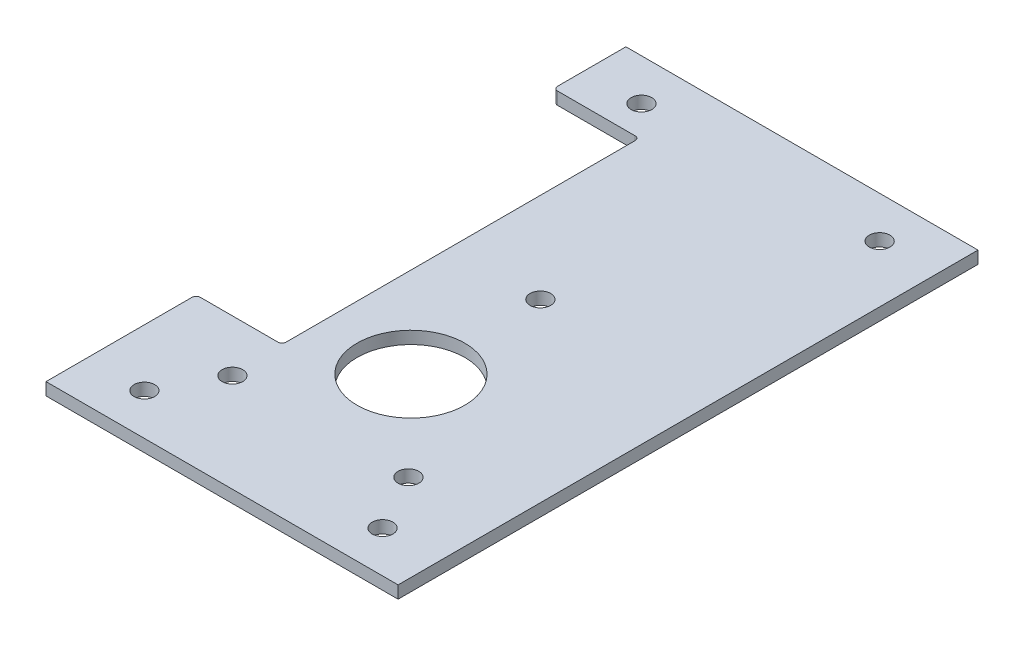
ISO-10303-21;
HEADER;
FILE_DESCRIPTION(('STEP AP214'),'2;1');
FILE_NAME('part.step','',(''),(''),'','','');
FILE_SCHEMA(('AUTOMOTIVE_DESIGN { 1 0 10303 214 1 1 1 1 }'));
ENDSEC;
DATA;
#1=APPLICATION_CONTEXT('core data for automotive mechanical design processes');
#2=APPLICATION_PROTOCOL_DEFINITION('international standard','automotive_design',2000,#1);
#3=PRODUCT_CONTEXT('',#1,'mechanical');
#4=PRODUCT('Part','Part','',(#3));
#5=PRODUCT_RELATED_PRODUCT_CATEGORY('part','',(#4));
#6=PRODUCT_DEFINITION_FORMATION('','',#4);
#7=PRODUCT_DEFINITION_CONTEXT('part definition',#1,'design');
#8=PRODUCT_DEFINITION('design','',#6,#7);
#9=PRODUCT_DEFINITION_SHAPE('','',#8);
#10=(LENGTH_UNIT() NAMED_UNIT(*) SI_UNIT(.MILLI.,.METRE.));
#11=(NAMED_UNIT(*) PLANE_ANGLE_UNIT() SI_UNIT($,.RADIAN.));
#12=(NAMED_UNIT(*) SI_UNIT($,.STERADIAN.) SOLID_ANGLE_UNIT());
#13=UNCERTAINTY_MEASURE_WITH_UNIT(LENGTH_MEASURE(1.E-05),#10,'distance_accuracy_value','');
#14=(GEOMETRIC_REPRESENTATION_CONTEXT(3) GLOBAL_UNCERTAINTY_ASSIGNED_CONTEXT((#13)) GLOBAL_UNIT_ASSIGNED_CONTEXT((#10,
#11,#12)) REPRESENTATION_CONTEXT('',''));
#15=CARTESIAN_POINT('',(0.,0.,0.));
#16=DIRECTION('',(0.,0.,1.));
#17=DIRECTION('',(1.,0.,0.));
#18=AXIS2_PLACEMENT_3D('',#15,#16,#17);
#19=CARTESIAN_POINT('',(-85.,6.,140.));
#20=DIRECTION('',(1.,0.,0.));
#21=DIRECTION('',(0.,0.,-1.));
#22=AXIS2_PLACEMENT_3D('',#19,#20,#21);
#23=PLANE('',#22);
#24=DIRECTION('',(0.,0.,1.));
#25=VECTOR('',#24,1.);
#26=CARTESIAN_POINT('',(-85.,0.,140.));
#27=LINE('',#26,#25);
#28=CARTESIAN_POINT('',(-85.,0.,-140.));
#29=VERTEX_POINT('',#28);
#30=CARTESIAN_POINT('',(-85.,0.,-107.));
#31=VERTEX_POINT('',#30);
#32=EDGE_CURVE('E224',#29,#31,#27,.T.);
#33=ORIENTED_EDGE('',*,*,#32,.T.);
#34=DIRECTION('',(0.,1.,0.));
#35=VECTOR('',#34,1.);
#36=CARTESIAN_POINT('',(-85.,6.,-107.));
#37=LINE('',#36,#35);
#38=CARTESIAN_POINT('',(-85.,6.,-107.));
#39=VERTEX_POINT('',#38);
#40=EDGE_CURVE('E192',#31,#39,#37,.T.);
#41=ORIENTED_EDGE('',*,*,#40,.T.);
#42=DIRECTION('',(0.,0.,1.));
#43=VECTOR('',#42,1.);
#44=CARTESIAN_POINT('',(-85.,6.,140.));
#45=LINE('',#44,#43);
#46=CARTESIAN_POINT('',(-85.,6.,-140.));
#47=VERTEX_POINT('',#46);
#48=EDGE_CURVE('E223',#47,#39,#45,.T.);
#49=ORIENTED_EDGE('',*,*,#48,.F.);
#50=DIRECTION('',(0.,-1.,0.));
#51=VECTOR('',#50,1.);
#52=CARTESIAN_POINT('',(-85.,6.,-140.));
#53=LINE('',#52,#51);
#54=EDGE_CURVE('E136',#47,#29,#53,.T.);
#55=ORIENTED_EDGE('',*,*,#54,.T.);
#56=EDGE_LOOP('',(#33,#41,#49,#55));
#57=FACE_BOUND('',#56,.T.);
#58=ADVANCED_FACE('F37',(#57),#23,.F.);
#59=CARTESIAN_POINT('',(85.,6.,140.));
#60=DIRECTION('',(-1.,0.,0.));
#61=DIRECTION('',(0.,0.,1.));
#62=AXIS2_PLACEMENT_3D('',#59,#60,#61);
#63=PLANE('',#62);
#64=DIRECTION('',(0.,0.,-1.));
#65=VECTOR('',#64,1.);
#66=CARTESIAN_POINT('',(85.,0.,140.));
#67=LINE('',#66,#65);
#68=CARTESIAN_POINT('',(85.,0.,140.));
#69=VERTEX_POINT('',#68);
#70=CARTESIAN_POINT('',(85.,0.,-140.));
#71=VERTEX_POINT('',#70);
#72=EDGE_CURVE('E155',#69,#71,#67,.T.);
#73=ORIENTED_EDGE('',*,*,#72,.T.);
#74=DIRECTION('',(0.,-1.,0.));
#75=VECTOR('',#74,1.);
#76=CARTESIAN_POINT('',(85.,6.,-140.));
#77=LINE('',#76,#75);
#78=CARTESIAN_POINT('',(85.,6.,-140.));
#79=VERTEX_POINT('',#78);
#80=EDGE_CURVE('E133',#79,#71,#77,.T.);
#81=ORIENTED_EDGE('',*,*,#80,.F.);
#82=DIRECTION('',(0.,0.,-1.));
#83=VECTOR('',#82,1.);
#84=CARTESIAN_POINT('',(85.,6.,140.));
#85=LINE('',#84,#83);
#86=CARTESIAN_POINT('',(85.,6.,140.));
#87=VERTEX_POINT('',#86);
#88=EDGE_CURVE('E141',#87,#79,#85,.T.);
#89=ORIENTED_EDGE('',*,*,#88,.F.);
#90=DIRECTION('',(0.,-1.,0.));
#91=VECTOR('',#90,1.);
#92=CARTESIAN_POINT('',(85.,6.,140.));
#93=LINE('',#92,#91);
#94=EDGE_CURVE('E226',#87,#69,#93,.T.);
#95=ORIENTED_EDGE('',*,*,#94,.T.);
#96=EDGE_LOOP('',(#73,#81,#89,#95));
#97=FACE_BOUND('',#96,.T.);
#98=ADVANCED_FACE('F153',(#97),#63,.F.);
#99=CARTESIAN_POINT('',(-85.,6.,-140.));
#100=DIRECTION('',(0.,0.,1.));
#101=DIRECTION('',(1.,0.,0.));
#102=AXIS2_PLACEMENT_3D('',#99,#100,#101);
#103=PLANE('',#102);
#104=DIRECTION('',(-1.,0.,0.));
#105=VECTOR('',#104,1.);
#106=CARTESIAN_POINT('',(-85.,0.,-140.));
#107=LINE('',#106,#105);
#108=EDGE_CURVE('E230',#71,#29,#107,.T.);
#109=ORIENTED_EDGE('',*,*,#108,.T.);
#110=ORIENTED_EDGE('',*,*,#54,.F.);
#111=DIRECTION('',(-1.,0.,0.));
#112=VECTOR('',#111,1.);
#113=CARTESIAN_POINT('',(-85.,6.,-140.));
#114=LINE('',#113,#112);
#115=EDGE_CURVE('E129',#79,#47,#114,.T.);
#116=ORIENTED_EDGE('',*,*,#115,.F.);
#117=ORIENTED_EDGE('',*,*,#80,.T.);
#118=EDGE_LOOP('',(#109,#110,#116,#117));
#119=FACE_BOUND('',#118,.T.);
#120=ADVANCED_FACE('F131',(#119),#103,.F.);
#121=CARTESIAN_POINT('',(-85.,6.,69.5));
#122=VERTEX_POINT('',#121);
#123=CARTESIAN_POINT('',(-85.,6.,140.));
#124=VERTEX_POINT('',#123);
#125=EDGE_CURVE('E140',#122,#124,#45,.T.);
#126=ORIENTED_EDGE('',*,*,#125,.F.);
#127=DIRECTION('',(0.,1.,0.));
#128=VECTOR('',#127,1.);
#129=CARTESIAN_POINT('',(-85.,6.,69.5));
#130=LINE('',#129,#128);
#131=CARTESIAN_POINT('',(-85.,0.,69.5));
#132=VERTEX_POINT('',#131);
#133=EDGE_CURVE('E178',#122,#132,#130,.F.);
#134=ORIENTED_EDGE('',*,*,#133,.T.);
#135=CARTESIAN_POINT('',(-85.,0.,140.));
#136=VERTEX_POINT('',#135);
#137=EDGE_CURVE('E233',#132,#136,#27,.T.);
#138=ORIENTED_EDGE('',*,*,#137,.T.);
#139=DIRECTION('',(0.,-1.,0.));
#140=VECTOR('',#139,1.);
#141=CARTESIAN_POINT('',(-85.,6.,140.));
#142=LINE('',#141,#140);
#143=EDGE_CURVE('E160',#124,#136,#142,.T.);
#144=ORIENTED_EDGE('',*,*,#143,.F.);
#145=EDGE_LOOP('',(#126,#134,#138,#144));
#146=FACE_BOUND('',#145,.T.);
#147=ADVANCED_FACE('F308',(#146),#23,.F.);
#148=CARTESIAN_POINT('',(-85.,6.,140.));
#149=DIRECTION('',(0.,0.,-1.));
#150=DIRECTION('',(-1.,0.,0.));
#151=AXIS2_PLACEMENT_3D('',#148,#149,#150);
#152=PLANE('',#151);
#153=DIRECTION('',(1.,0.,0.));
#154=VECTOR('',#153,1.);
#155=CARTESIAN_POINT('',(-85.,0.,140.));
#156=LINE('',#155,#154);
#157=EDGE_CURVE('E151',#136,#69,#156,.T.);
#158=ORIENTED_EDGE('',*,*,#157,.T.);
#159=ORIENTED_EDGE('',*,*,#94,.F.);
#160=DIRECTION('',(1.,0.,0.));
#161=VECTOR('',#160,1.);
#162=CARTESIAN_POINT('',(-85.,6.,140.));
#163=LINE('',#162,#161);
#164=EDGE_CURVE('E147',#124,#87,#163,.T.);
#165=ORIENTED_EDGE('',*,*,#164,.F.);
#166=ORIENTED_EDGE('',*,*,#143,.T.);
#167=EDGE_LOOP('',(#158,#159,#165,#166));
#168=FACE_BOUND('',#167,.T.);
#169=ADVANCED_FACE('F240',(#168),#152,.F.);
#170=CARTESIAN_POINT('',(0.,6.,0.));
#171=DIRECTION('',(0.,-1.,0.));
#172=DIRECTION('',(0.,0.,-1.));
#173=AXIS2_PLACEMENT_3D('',#170,#171,#172);
#174=PLANE('',#173);
#175=CARTESIAN_POINT('',(0.,6.,48.8));
#176=DIRECTION('',(0.,1.,0.));
#177=DIRECTION('',(0.,0.,1.));
#178=AXIS2_PLACEMENT_3D('',#175,#176,#177);
#179=CIRCLE('',#178,26.);
#180=CARTESIAN_POINT('',(0.,6.,74.8));
#181=VERTEX_POINT('',#180);
#182=EDGE_CURVE('E528',#181,#181,#179,.T.);
#183=ORIENTED_EDGE('',*,*,#182,.F.);
#184=EDGE_LOOP('',(#183));
#185=FACE_BOUND('',#184,.T.);
#186=CARTESIAN_POINT('',(57.5,6.,-120.));
#187=DIRECTION('',(0.,1.,0.));
#188=DIRECTION('',(0.,0.,1.));
#189=AXIS2_PLACEMENT_3D('',#186,#187,#188);
#190=CIRCLE('',#189,5.00000000000001);
#191=CARTESIAN_POINT('',(57.5,6.,-115.));
#192=VERTEX_POINT('',#191);
#193=EDGE_CURVE('E272',#192,#192,#190,.T.);
#194=ORIENTED_EDGE('',*,*,#193,.F.);
#195=EDGE_LOOP('',(#194));
#196=FACE_BOUND('',#195,.T.);
#197=CARTESIAN_POINT('',(0.,6.,-13.7));
#198=DIRECTION('',(0.,1.,0.));
#199=DIRECTION('',(0.,0.,1.));
#200=AXIS2_PLACEMENT_3D('',#197,#198,#199);
#201=CIRCLE('',#200,5.);
#202=CARTESIAN_POINT('',(0.,6.,-8.70000000000001));
#203=VERTEX_POINT('',#202);
#204=EDGE_CURVE('E278',#203,#203,#201,.T.);
#205=ORIENTED_EDGE('',*,*,#204,.F.);
#206=EDGE_LOOP('',(#205));
#207=FACE_BOUND('',#206,.T.);
#208=CARTESIAN_POINT('',(-57.5,6.,120.));
#209=DIRECTION('',(0.,1.,0.));
#210=DIRECTION('',(0.,0.,1.));
#211=AXIS2_PLACEMENT_3D('',#208,#209,#210);
#212=CIRCLE('',#211,5.);
#213=CARTESIAN_POINT('',(-57.5,6.,125.));
#214=VERTEX_POINT('',#213);
#215=EDGE_CURVE('E284',#214,#214,#212,.T.);
#216=ORIENTED_EDGE('',*,*,#215,.F.);
#217=EDGE_LOOP('',(#216));
#218=FACE_BOUND('',#217,.T.);
#219=CARTESIAN_POINT('',(57.5000000000001,6.,120.));
#220=DIRECTION('',(0.,1.,0.));
#221=DIRECTION('',(0.,0.,1.));
#222=AXIS2_PLACEMENT_3D('',#219,#220,#221);
#223=CIRCLE('',#222,5.);
#224=CARTESIAN_POINT('',(57.5000000000001,6.,125.));
#225=VERTEX_POINT('',#224);
#226=EDGE_CURVE('E262',#225,#225,#223,.T.);
#227=ORIENTED_EDGE('',*,*,#226,.F.);
#228=EDGE_LOOP('',(#227));
#229=FACE_BOUND('',#228,.T.);
#230=CARTESIAN_POINT('',(42.5,6.,92.5));
#231=DIRECTION('',(0.,1.,0.));
#232=DIRECTION('',(0.,0.,1.));
#233=AXIS2_PLACEMENT_3D('',#230,#231,#232);
#234=CIRCLE('',#233,5.00000000000001);
#235=CARTESIAN_POINT('',(42.5,6.,97.5));
#236=VERTEX_POINT('',#235);
#237=EDGE_CURVE('E263',#236,#236,#234,.T.);
#238=ORIENTED_EDGE('',*,*,#237,.F.);
#239=EDGE_LOOP('',(#238));
#240=FACE_BOUND('',#239,.T.);
#241=CARTESIAN_POINT('',(-42.5,6.,92.5));
#242=DIRECTION('',(0.,1.,0.));
#243=DIRECTION('',(0.,0.,1.));
#244=AXIS2_PLACEMENT_3D('',#241,#242,#243);
#245=CIRCLE('',#244,5.00000000000001);
#246=CARTESIAN_POINT('',(-42.5,6.,97.5));
#247=VERTEX_POINT('',#246);
#248=EDGE_CURVE('E253',#247,#247,#245,.T.);
#249=ORIENTED_EDGE('',*,*,#248,.F.);
#250=EDGE_LOOP('',(#249));
#251=FACE_BOUND('',#250,.T.);
#252=CARTESIAN_POINT('',(-57.5,6.,-120.));
#253=DIRECTION('',(0.,1.,0.));
#254=DIRECTION('',(0.,0.,1.));
#255=AXIS2_PLACEMENT_3D('',#252,#253,#254);
#256=CIRCLE('',#255,5.);
#257=CARTESIAN_POINT('',(-57.5,6.,-115.));
#258=VERTEX_POINT('',#257);
#259=EDGE_CURVE('E271',#258,#258,#256,.T.);
#260=ORIENTED_EDGE('',*,*,#259,.F.);
#261=EDGE_LOOP('',(#260));
#262=FACE_BOUND('',#261,.T.);
#263=DIRECTION('',(1.,0.,0.));
#264=VECTOR('',#263,1.);
#265=CARTESIAN_POINT('',(0.,6.,67.5));
#266=LINE('',#265,#264);
#267=CARTESIAN_POINT('',(-83.,6.,67.5));
#268=VERTEX_POINT('',#267);
#269=CARTESIAN_POINT('',(-45.5446105871047,6.,67.5));
#270=VERTEX_POINT('',#269);
#271=EDGE_CURVE('E218',#268,#270,#266,.T.);
#272=ORIENTED_EDGE('',*,*,#271,.F.);
#273=CARTESIAN_POINT('',(-83.,6.,69.5));
#274=DIRECTION('',(0.,-1.,0.));
#275=DIRECTION('',(0.,0.,-1.));
#276=AXIS2_PLACEMENT_3D('',#273,#274,#275);
#277=CIRCLE('',#276,2.);
#278=EDGE_CURVE('E176',#268,#122,#277,.F.);
#279=ORIENTED_EDGE('',*,*,#278,.T.);
#280=ORIENTED_EDGE('',*,*,#125,.T.);
#281=ORIENTED_EDGE('',*,*,#164,.T.);
#282=ORIENTED_EDGE('',*,*,#88,.T.);
#283=ORIENTED_EDGE('',*,*,#115,.T.);
#284=ORIENTED_EDGE('',*,*,#48,.T.);
#285=CARTESIAN_POINT('',(-83.,6.,-107.));
#286=DIRECTION('',(0.,-1.,0.));
#287=DIRECTION('',(0.,0.,-1.));
#288=AXIS2_PLACEMENT_3D('',#285,#286,#287);
#289=CIRCLE('',#288,2.);
#290=CARTESIAN_POINT('',(-83.,6.,-105.));
#291=VERTEX_POINT('',#290);
#292=EDGE_CURVE('E174',#39,#291,#289,.F.);
#293=ORIENTED_EDGE('',*,*,#292,.T.);
#294=DIRECTION('',(1.,0.,0.));
#295=VECTOR('',#294,1.);
#296=CARTESIAN_POINT('',(0.,6.,-105.));
#297=LINE('',#296,#295);
#298=CARTESIAN_POINT('',(-45.5446105871047,6.,-105.));
#299=VERTEX_POINT('',#298);
#300=EDGE_CURVE('E203',#291,#299,#297,.T.);
#301=ORIENTED_EDGE('',*,*,#300,.T.);
#302=CARTESIAN_POINT('',(-45.5446105871047,6.,-103.));
#303=DIRECTION('',(0.,-1.,0.));
#304=DIRECTION('',(0.,0.,-1.));
#305=AXIS2_PLACEMENT_3D('',#302,#303,#304);
#306=CIRCLE('',#305,2.);
#307=CARTESIAN_POINT('',(-43.5446105871047,6.,-103.));
#308=VERTEX_POINT('',#307);
#309=EDGE_CURVE('E46',#299,#308,#306,.T.);
#310=ORIENTED_EDGE('',*,*,#309,.T.);
#311=DIRECTION('',(0.,0.,1.));
#312=VECTOR('',#311,1.);
#313=CARTESIAN_POINT('',(-43.5446105871047,6.,0.));
#314=LINE('',#313,#312);
#315=CARTESIAN_POINT('',(-43.5446105871047,6.,65.5));
#316=VERTEX_POINT('',#315);
#317=EDGE_CURVE('E202',#308,#316,#314,.T.);
#318=ORIENTED_EDGE('',*,*,#317,.T.);
#319=CARTESIAN_POINT('',(-45.5446105871047,6.,65.5));
#320=DIRECTION('',(0.,-1.,0.));
#321=DIRECTION('',(0.,0.,-1.));
#322=AXIS2_PLACEMENT_3D('',#319,#320,#321);
#323=CIRCLE('',#322,2.);
#324=EDGE_CURVE('E195',#316,#270,#323,.T.);
#325=ORIENTED_EDGE('',*,*,#324,.T.);
#326=EDGE_LOOP('',(#272,#279,#280,#281,#282,#283,#284,#293,#301,#310,#318,#325));
#327=FACE_BOUND('',#326,.T.);
#328=ADVANCED_FACE('F145',(#185,#196,#207,#218,#229,#240,#251,#262,#327),#174,.F.);
#329=CARTESIAN_POINT('',(0.,0.,0.));
#330=DIRECTION('',(0.,-1.,0.));
#331=DIRECTION('',(0.,0.,-1.));
#332=AXIS2_PLACEMENT_3D('',#329,#330,#331);
#333=PLANE('',#332);
#334=CARTESIAN_POINT('',(0.,0.,48.8));
#335=DIRECTION('',(0.,-1.,0.));
#336=DIRECTION('',(0.,0.,-1.));
#337=AXIS2_PLACEMENT_3D('',#334,#335,#336);
#338=CIRCLE('',#337,26.);
#339=CARTESIAN_POINT('',(0.,0.,22.8));
#340=VERTEX_POINT('',#339);
#341=EDGE_CURVE('E41',#340,#340,#338,.T.);
#342=ORIENTED_EDGE('',*,*,#341,.F.);
#343=EDGE_LOOP('',(#342));
#344=FACE_BOUND('',#343,.T.);
#345=ORIENTED_EDGE('',*,*,#137,.F.);
#346=CARTESIAN_POINT('',(-83.,0.,69.5));
#347=DIRECTION('',(0.,-1.,0.));
#348=DIRECTION('',(0.,0.,-1.));
#349=AXIS2_PLACEMENT_3D('',#346,#347,#348);
#350=CIRCLE('',#349,2.);
#351=CARTESIAN_POINT('',(-83.,0.,67.5));
#352=VERTEX_POINT('',#351);
#353=EDGE_CURVE('E181',#132,#352,#350,.T.);
#354=ORIENTED_EDGE('',*,*,#353,.T.);
#355=DIRECTION('',(-1.,0.,0.));
#356=VECTOR('',#355,1.);
#357=CARTESIAN_POINT('',(0.,0.,67.5));
#358=LINE('',#357,#356);
#359=CARTESIAN_POINT('',(-45.5446105871047,0.,67.5));
#360=VERTEX_POINT('',#359);
#361=EDGE_CURVE('E166',#360,#352,#358,.T.);
#362=ORIENTED_EDGE('',*,*,#361,.F.);
#363=CARTESIAN_POINT('',(-45.5446105871047,0.,65.5));
#364=DIRECTION('',(0.,-1.,0.));
#365=DIRECTION('',(0.,0.,-1.));
#366=AXIS2_PLACEMENT_3D('',#363,#364,#365);
#367=CIRCLE('',#366,2.);
#368=CARTESIAN_POINT('',(-43.5446105871047,0.,65.5));
#369=VERTEX_POINT('',#368);
#370=EDGE_CURVE('E197',#360,#369,#367,.F.);
#371=ORIENTED_EDGE('',*,*,#370,.T.);
#372=DIRECTION('',(0.,0.,-1.));
#373=VECTOR('',#372,1.);
#374=CARTESIAN_POINT('',(-43.5446105871047,0.,0.));
#375=LINE('',#374,#373);
#376=CARTESIAN_POINT('',(-43.5446105871047,0.,-103.));
#377=VERTEX_POINT('',#376);
#378=EDGE_CURVE('E158',#369,#377,#375,.T.);
#379=ORIENTED_EDGE('',*,*,#378,.T.);
#380=CARTESIAN_POINT('',(-45.5446105871047,0.,-103.));
#381=DIRECTION('',(0.,-1.,0.));
#382=DIRECTION('',(0.,0.,-1.));
#383=AXIS2_PLACEMENT_3D('',#380,#381,#382);
#384=CIRCLE('',#383,2.);
#385=CARTESIAN_POINT('',(-45.5446105871047,0.,-105.));
#386=VERTEX_POINT('',#385);
#387=EDGE_CURVE('E11',#377,#386,#384,.F.);
#388=ORIENTED_EDGE('',*,*,#387,.T.);
#389=DIRECTION('',(-1.,0.,0.));
#390=VECTOR('',#389,1.);
#391=CARTESIAN_POINT('',(0.,0.,-105.));
#392=LINE('',#391,#390);
#393=CARTESIAN_POINT('',(-83.,0.,-105.));
#394=VERTEX_POINT('',#393);
#395=EDGE_CURVE('E156',#386,#394,#392,.T.);
#396=ORIENTED_EDGE('',*,*,#395,.T.);
#397=CARTESIAN_POINT('',(-83.,0.,-107.));
#398=DIRECTION('',(0.,-1.,0.));
#399=DIRECTION('',(0.,0.,-1.));
#400=AXIS2_PLACEMENT_3D('',#397,#398,#399);
#401=CIRCLE('',#400,2.);
#402=EDGE_CURVE('E53',#394,#31,#401,.T.);
#403=ORIENTED_EDGE('',*,*,#402,.T.);
#404=ORIENTED_EDGE('',*,*,#32,.F.);
#405=ORIENTED_EDGE('',*,*,#108,.F.);
#406=ORIENTED_EDGE('',*,*,#72,.F.);
#407=ORIENTED_EDGE('',*,*,#157,.F.);
#408=EDGE_LOOP('',(#345,#354,#362,#371,#379,#388,#396,#403,#404,#405,#406,#407));
#409=FACE_BOUND('',#408,.T.);
#410=CARTESIAN_POINT('',(57.5,0.,-120.));
#411=DIRECTION('',(0.,1.,0.));
#412=DIRECTION('',(0.,0.,1.));
#413=AXIS2_PLACEMENT_3D('',#410,#411,#412);
#414=CIRCLE('',#413,5.00000000000001);
#415=CARTESIAN_POINT('',(57.5,0.,-115.));
#416=VERTEX_POINT('',#415);
#417=EDGE_CURVE('E268',#416,#416,#414,.T.);
#418=ORIENTED_EDGE('',*,*,#417,.T.);
#419=EDGE_LOOP('',(#418));
#420=FACE_BOUND('',#419,.T.);
#421=CARTESIAN_POINT('',(0.,0.,-13.7));
#422=DIRECTION('',(0.,1.,0.));
#423=DIRECTION('',(0.,0.,1.));
#424=AXIS2_PLACEMENT_3D('',#421,#422,#423);
#425=CIRCLE('',#424,5.);
#426=CARTESIAN_POINT('',(0.,0.,-8.70000000000001));
#427=VERTEX_POINT('',#426);
#428=EDGE_CURVE('E275',#427,#427,#425,.T.);
#429=ORIENTED_EDGE('',*,*,#428,.T.);
#430=EDGE_LOOP('',(#429));
#431=FACE_BOUND('',#430,.T.);
#432=CARTESIAN_POINT('',(-57.5,0.,120.));
#433=DIRECTION('',(0.,1.,0.));
#434=DIRECTION('',(0.,0.,1.));
#435=AXIS2_PLACEMENT_3D('',#432,#433,#434);
#436=CIRCLE('',#435,5.);
#437=CARTESIAN_POINT('',(-57.5,0.,125.));
#438=VERTEX_POINT('',#437);
#439=EDGE_CURVE('E281',#438,#438,#436,.T.);
#440=ORIENTED_EDGE('',*,*,#439,.T.);
#441=EDGE_LOOP('',(#440));
#442=FACE_BOUND('',#441,.T.);
#443=CARTESIAN_POINT('',(57.5000000000001,0.,120.));
#444=DIRECTION('',(0.,1.,0.));
#445=DIRECTION('',(0.,0.,1.));
#446=AXIS2_PLACEMENT_3D('',#443,#444,#445);
#447=CIRCLE('',#446,5.);
#448=CARTESIAN_POINT('',(57.5000000000001,0.,125.));
#449=VERTEX_POINT('',#448);
#450=EDGE_CURVE('E287',#449,#449,#447,.T.);
#451=ORIENTED_EDGE('',*,*,#450,.T.);
#452=EDGE_LOOP('',(#451));
#453=FACE_BOUND('',#452,.T.);
#454=CARTESIAN_POINT('',(42.5,0.,92.5));
#455=DIRECTION('',(0.,1.,0.));
#456=DIRECTION('',(0.,0.,1.));
#457=AXIS2_PLACEMENT_3D('',#454,#455,#456);
#458=CIRCLE('',#457,5.00000000000001);
#459=CARTESIAN_POINT('',(42.5,0.,97.5));
#460=VERTEX_POINT('',#459);
#461=EDGE_CURVE('E259',#460,#460,#458,.T.);
#462=ORIENTED_EDGE('',*,*,#461,.T.);
#463=EDGE_LOOP('',(#462));
#464=FACE_BOUND('',#463,.T.);
#465=CARTESIAN_POINT('',(-42.5,0.,92.5));
#466=DIRECTION('',(0.,1.,0.));
#467=DIRECTION('',(0.,0.,1.));
#468=AXIS2_PLACEMENT_3D('',#465,#466,#467);
#469=CIRCLE('',#468,5.00000000000001);
#470=CARTESIAN_POINT('',(-42.5,0.,97.5));
#471=VERTEX_POINT('',#470);
#472=EDGE_CURVE('E256',#471,#471,#469,.T.);
#473=ORIENTED_EDGE('',*,*,#472,.T.);
#474=EDGE_LOOP('',(#473));
#475=FACE_BOUND('',#474,.T.);
#476=CARTESIAN_POINT('',(-57.5,0.,-120.));
#477=DIRECTION('',(0.,1.,0.));
#478=DIRECTION('',(0.,0.,1.));
#479=AXIS2_PLACEMENT_3D('',#476,#477,#478);
#480=CIRCLE('',#479,5.);
#481=CARTESIAN_POINT('',(-57.5,0.,-115.));
#482=VERTEX_POINT('',#481);
#483=EDGE_CURVE('E231',#482,#482,#480,.T.);
#484=ORIENTED_EDGE('',*,*,#483,.T.);
#485=EDGE_LOOP('',(#484));
#486=FACE_BOUND('',#485,.T.);
#487=ADVANCED_FACE('F215',(#344,#409,#420,#431,#442,#453,#464,#475,#486),#333,.T.);
#488=CARTESIAN_POINT('',(-57.5,0.,-120.));
#489=DIRECTION('',(0.,1.,0.));
#490=DIRECTION('',(0.,0.,1.));
#491=AXIS2_PLACEMENT_3D('',#488,#489,#490);
#492=CYLINDRICAL_SURFACE('',#491,5.);
#493=ORIENTED_EDGE('',*,*,#483,.F.);
#494=EDGE_LOOP('',(#493));
#495=FACE_BOUND('',#494,.T.);
#496=ORIENTED_EDGE('',*,*,#259,.T.);
#497=EDGE_LOOP('',(#496));
#498=FACE_BOUND('',#497,.T.);
#499=ADVANCED_FACE('F297',(#495,#498),#492,.F.);
#500=CARTESIAN_POINT('',(-42.5,0.,92.5));
#501=DIRECTION('',(0.,1.,0.));
#502=DIRECTION('',(0.,0.,1.));
#503=AXIS2_PLACEMENT_3D('',#500,#501,#502);
#504=CYLINDRICAL_SURFACE('',#503,5.00000000000001);
#505=ORIENTED_EDGE('',*,*,#472,.F.);
#506=EDGE_LOOP('',(#505));
#507=FACE_BOUND('',#506,.T.);
#508=ORIENTED_EDGE('',*,*,#248,.T.);
#509=EDGE_LOOP('',(#508));
#510=FACE_BOUND('',#509,.T.);
#511=ADVANCED_FACE('F358',(#507,#510),#504,.F.);
#512=CARTESIAN_POINT('',(42.5,0.,92.5));
#513=DIRECTION('',(0.,1.,0.));
#514=DIRECTION('',(0.,0.,1.));
#515=AXIS2_PLACEMENT_3D('',#512,#513,#514);
#516=CYLINDRICAL_SURFACE('',#515,5.00000000000001);
#517=ORIENTED_EDGE('',*,*,#461,.F.);
#518=EDGE_LOOP('',(#517));
#519=FACE_BOUND('',#518,.T.);
#520=ORIENTED_EDGE('',*,*,#237,.T.);
#521=EDGE_LOOP('',(#520));
#522=FACE_BOUND('',#521,.T.);
#523=ADVANCED_FACE('F354',(#519,#522),#516,.F.);
#524=CARTESIAN_POINT('',(57.5000000000001,0.,120.));
#525=DIRECTION('',(0.,1.,0.));
#526=DIRECTION('',(0.,0.,1.));
#527=AXIS2_PLACEMENT_3D('',#524,#525,#526);
#528=CYLINDRICAL_SURFACE('',#527,5.);
#529=ORIENTED_EDGE('',*,*,#450,.F.);
#530=EDGE_LOOP('',(#529));
#531=FACE_BOUND('',#530,.T.);
#532=ORIENTED_EDGE('',*,*,#226,.T.);
#533=EDGE_LOOP('',(#532));
#534=FACE_BOUND('',#533,.T.);
#535=ADVANCED_FACE('F357',(#531,#534),#528,.F.);
#536=CARTESIAN_POINT('',(-57.5,0.,120.));
#537=DIRECTION('',(0.,1.,0.));
#538=DIRECTION('',(0.,0.,1.));
#539=AXIS2_PLACEMENT_3D('',#536,#537,#538);
#540=CYLINDRICAL_SURFACE('',#539,5.);
#541=ORIENTED_EDGE('',*,*,#439,.F.);
#542=EDGE_LOOP('',(#541));
#543=FACE_BOUND('',#542,.T.);
#544=ORIENTED_EDGE('',*,*,#215,.T.);
#545=EDGE_LOOP('',(#544));
#546=FACE_BOUND('',#545,.T.);
#547=ADVANCED_FACE('F369',(#543,#546),#540,.F.);
#548=CARTESIAN_POINT('',(0.,0.,-13.7));
#549=DIRECTION('',(0.,1.,0.));
#550=DIRECTION('',(0.,0.,1.));
#551=AXIS2_PLACEMENT_3D('',#548,#549,#550);
#552=CYLINDRICAL_SURFACE('',#551,5.);
#553=ORIENTED_EDGE('',*,*,#428,.F.);
#554=EDGE_LOOP('',(#553));
#555=FACE_BOUND('',#554,.T.);
#556=ORIENTED_EDGE('',*,*,#204,.T.);
#557=EDGE_LOOP('',(#556));
#558=FACE_BOUND('',#557,.T.);
#559=ADVANCED_FACE('F365',(#555,#558),#552,.F.);
#560=CARTESIAN_POINT('',(57.5,0.,-120.));
#561=DIRECTION('',(0.,1.,0.));
#562=DIRECTION('',(0.,0.,1.));
#563=AXIS2_PLACEMENT_3D('',#560,#561,#562);
#564=CYLINDRICAL_SURFACE('',#563,5.00000000000001);
#565=ORIENTED_EDGE('',*,*,#417,.F.);
#566=EDGE_LOOP('',(#565));
#567=FACE_BOUND('',#566,.T.);
#568=ORIENTED_EDGE('',*,*,#193,.T.);
#569=EDGE_LOOP('',(#568));
#570=FACE_BOUND('',#569,.T.);
#571=ADVANCED_FACE('F353',(#567,#570),#564,.F.);
#572=CARTESIAN_POINT('',(-43.5446105871047,-4.,0.));
#573=DIRECTION('',(-1.,0.,0.));
#574=DIRECTION('',(0.,0.,1.));
#575=AXIS2_PLACEMENT_3D('',#572,#573,#574);
#576=PLANE('',#575);
#577=ORIENTED_EDGE('',*,*,#378,.F.);
#578=DIRECTION('',(0.,1.,0.));
#579=VECTOR('',#578,1.);
#580=CARTESIAN_POINT('',(-43.5446105871047,-4.,65.5));
#581=LINE('',#580,#579);
#582=EDGE_CURVE('E185',#369,#316,#581,.T.);
#583=ORIENTED_EDGE('',*,*,#582,.T.);
#584=ORIENTED_EDGE('',*,*,#317,.F.);
#585=DIRECTION('',(0.,1.,0.));
#586=VECTOR('',#585,1.);
#587=CARTESIAN_POINT('',(-43.5446105871047,0.,-103.));
#588=LINE('',#587,#586);
#589=EDGE_CURVE('E183',#308,#377,#588,.F.);
#590=ORIENTED_EDGE('',*,*,#589,.T.);
#591=EDGE_LOOP('',(#577,#583,#584,#590));
#592=FACE_BOUND('',#591,.T.);
#593=ADVANCED_FACE('F209',(#592),#576,.T.);
#594=CARTESIAN_POINT('',(0.,-4.,67.5));
#595=DIRECTION('',(0.,0.,1.));
#596=DIRECTION('',(1.,0.,0.));
#597=AXIS2_PLACEMENT_3D('',#594,#595,#596);
#598=PLANE('',#597);
#599=ORIENTED_EDGE('',*,*,#361,.T.);
#600=DIRECTION('',(0.,1.,0.));
#601=VECTOR('',#600,1.);
#602=CARTESIAN_POINT('',(-83.,-4.,67.5));
#603=LINE('',#602,#601);
#604=EDGE_CURVE('E171',#352,#268,#603,.T.);
#605=ORIENTED_EDGE('',*,*,#604,.T.);
#606=ORIENTED_EDGE('',*,*,#271,.T.);
#607=DIRECTION('',(0.,1.,0.));
#608=VECTOR('',#607,1.);
#609=CARTESIAN_POINT('',(-45.5446105871047,-4.,67.5));
#610=LINE('',#609,#608);
#611=EDGE_CURVE('E169',#270,#360,#610,.F.);
#612=ORIENTED_EDGE('',*,*,#611,.T.);
#613=EDGE_LOOP('',(#599,#605,#606,#612));
#614=FACE_BOUND('',#613,.T.);
#615=ADVANCED_FACE('F251',(#614),#598,.F.);
#616=CARTESIAN_POINT('',(0.,-4.,-105.));
#617=DIRECTION('',(0.,0.,1.));
#618=DIRECTION('',(1.,0.,0.));
#619=AXIS2_PLACEMENT_3D('',#616,#617,#618);
#620=PLANE('',#619);
#621=ORIENTED_EDGE('',*,*,#395,.F.);
#622=DIRECTION('',(0.,1.,0.));
#623=VECTOR('',#622,1.);
#624=CARTESIAN_POINT('',(-45.5446105871047,6.,-105.));
#625=LINE('',#624,#623);
#626=EDGE_CURVE('E189',#386,#299,#625,.T.);
#627=ORIENTED_EDGE('',*,*,#626,.T.);
#628=ORIENTED_EDGE('',*,*,#300,.F.);
#629=DIRECTION('',(0.,1.,0.));
#630=VECTOR('',#629,1.);
#631=CARTESIAN_POINT('',(-83.,0.,-105.));
#632=LINE('',#631,#630);
#633=EDGE_CURVE('E61',#291,#394,#632,.F.);
#634=ORIENTED_EDGE('',*,*,#633,.T.);
#635=EDGE_LOOP('',(#621,#627,#628,#634));
#636=FACE_BOUND('',#635,.T.);
#637=ADVANCED_FACE('F217',(#636),#620,.T.);
#638=CARTESIAN_POINT('',(-83.,-4.,69.5));
#639=DIRECTION('',(0.,1.,0.));
#640=DIRECTION('',(0.,0.,1.));
#641=AXIS2_PLACEMENT_3D('',#638,#639,#640);
#642=CYLINDRICAL_SURFACE('',#641,2.);
#643=ORIENTED_EDGE('',*,*,#353,.F.);
#644=ORIENTED_EDGE('',*,*,#133,.F.);
#645=ORIENTED_EDGE('',*,*,#278,.F.);
#646=ORIENTED_EDGE('',*,*,#604,.F.);
#647=EDGE_LOOP('',(#643,#644,#645,#646));
#648=FACE_BOUND('',#647,.T.);
#649=ADVANCED_FACE('F248',(#648),#642,.T.);
#650=CARTESIAN_POINT('',(-45.5446105871047,-4.,65.5));
#651=DIRECTION('',(0.,1.,0.));
#652=DIRECTION('',(0.,0.,1.));
#653=AXIS2_PLACEMENT_3D('',#650,#651,#652);
#654=CYLINDRICAL_SURFACE('',#653,2.);
#655=ORIENTED_EDGE('',*,*,#370,.F.);
#656=ORIENTED_EDGE('',*,*,#611,.F.);
#657=ORIENTED_EDGE('',*,*,#324,.F.);
#658=ORIENTED_EDGE('',*,*,#582,.F.);
#659=EDGE_LOOP('',(#655,#656,#657,#658));
#660=FACE_BOUND('',#659,.T.);
#661=ADVANCED_FACE('F329',(#660),#654,.F.);
#662=CARTESIAN_POINT('',(-45.5446105871047,-4.,-103.));
#663=DIRECTION('',(0.,-1.,0.));
#664=DIRECTION('',(0.,0.,-1.));
#665=AXIS2_PLACEMENT_3D('',#662,#663,#664);
#666=CYLINDRICAL_SURFACE('',#665,2.);
#667=ORIENTED_EDGE('',*,*,#387,.F.);
#668=ORIENTED_EDGE('',*,*,#589,.F.);
#669=ORIENTED_EDGE('',*,*,#309,.F.);
#670=ORIENTED_EDGE('',*,*,#626,.F.);
#671=EDGE_LOOP('',(#667,#668,#669,#670));
#672=FACE_BOUND('',#671,.T.);
#673=ADVANCED_FACE('F213',(#672),#666,.F.);
#674=CARTESIAN_POINT('',(-83.,6.,-107.));
#675=DIRECTION('',(0.,-1.,0.));
#676=DIRECTION('',(0.,0.,-1.));
#677=AXIS2_PLACEMENT_3D('',#674,#675,#676);
#678=CYLINDRICAL_SURFACE('',#677,2.);
#679=ORIENTED_EDGE('',*,*,#402,.F.);
#680=ORIENTED_EDGE('',*,*,#633,.F.);
#681=ORIENTED_EDGE('',*,*,#292,.F.);
#682=ORIENTED_EDGE('',*,*,#40,.F.);
#683=EDGE_LOOP('',(#679,#680,#681,#682));
#684=FACE_BOUND('',#683,.T.);
#685=ADVANCED_FACE('F39',(#684),#678,.T.);
#686=CARTESIAN_POINT('',(0.,-4.,48.8));
#687=DIRECTION('',(0.,1.,0.));
#688=DIRECTION('',(0.,0.,1.));
#689=AXIS2_PLACEMENT_3D('',#686,#687,#688);
#690=CYLINDRICAL_SURFACE('',#689,26.);
#691=ORIENTED_EDGE('',*,*,#341,.T.);
#692=EDGE_LOOP('',(#691));
#693=FACE_BOUND('',#692,.T.);
#694=ORIENTED_EDGE('',*,*,#182,.T.);
#695=EDGE_LOOP('',(#694));
#696=FACE_BOUND('',#695,.T.);
#697=ADVANCED_FACE('F336',(#693,#696),#690,.F.);
#698=CLOSED_SHELL('',(#58,#98,#120,#147,#169,#328,#487,#499,#511,#523,#535,#547,#559,#571,#593,
#615,#637,#649,#661,#673,#685,#697));
#699=MANIFOLD_SOLID_BREP('B2',#698);
#700=ADVANCED_BREP_SHAPE_REPRESENTATION('',(#18,#699),#14);
#701=SHAPE_DEFINITION_REPRESENTATION(#9,#700);
ENDSEC;
END-ISO-10303-21;
